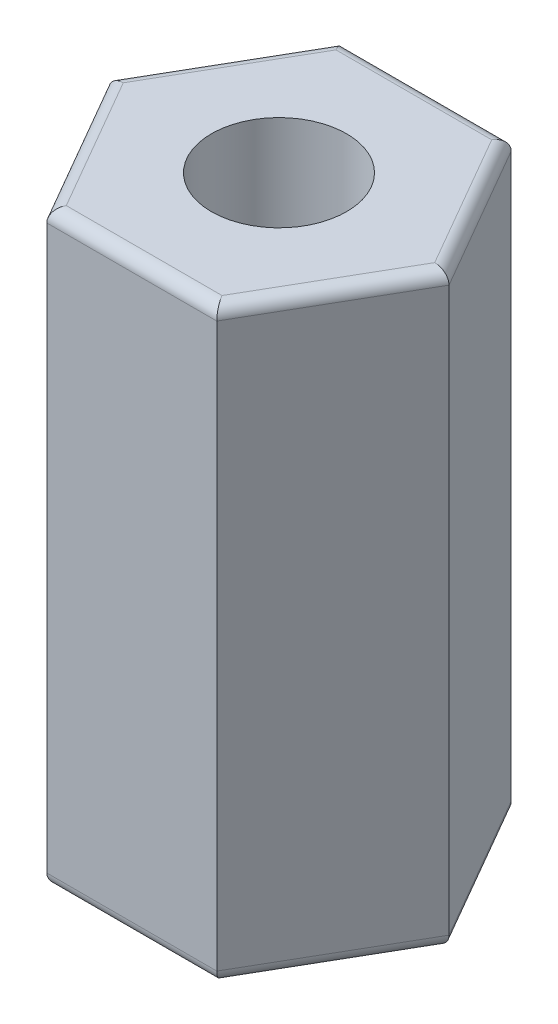
ISO-10303-21;
HEADER;
FILE_DESCRIPTION(('STEP AP214'),'2;1');
FILE_NAME('part.step','',(''),(''),'','','');
FILE_SCHEMA(('AUTOMOTIVE_DESIGN { 1 0 10303 214 1 1 1 1 }'));
ENDSEC;
DATA;
#1=APPLICATION_CONTEXT('core data for automotive mechanical design processes');
#2=APPLICATION_PROTOCOL_DEFINITION('international standard','automotive_design',2000,#1);
#3=PRODUCT_CONTEXT('',#1,'mechanical');
#4=PRODUCT('Part','Part','',(#3));
#5=PRODUCT_RELATED_PRODUCT_CATEGORY('part','',(#4));
#6=PRODUCT_DEFINITION_FORMATION('','',#4);
#7=PRODUCT_DEFINITION_CONTEXT('part definition',#1,'design');
#8=PRODUCT_DEFINITION('design','',#6,#7);
#9=PRODUCT_DEFINITION_SHAPE('','',#8);
#10=(LENGTH_UNIT() NAMED_UNIT(*) SI_UNIT(.MILLI.,.METRE.));
#11=(NAMED_UNIT(*) PLANE_ANGLE_UNIT() SI_UNIT($,.RADIAN.));
#12=(NAMED_UNIT(*) SI_UNIT($,.STERADIAN.) SOLID_ANGLE_UNIT());
#13=UNCERTAINTY_MEASURE_WITH_UNIT(LENGTH_MEASURE(1.E-05),#10,'distance_accuracy_value','');
#14=(GEOMETRIC_REPRESENTATION_CONTEXT(3) GLOBAL_UNCERTAINTY_ASSIGNED_CONTEXT((#13)) GLOBAL_UNIT_ASSIGNED_CONTEXT((#10,
#11,#12)) REPRESENTATION_CONTEXT('',''));
#15=CARTESIAN_POINT('',(0.,0.,0.));
#16=DIRECTION('',(0.,0.,1.));
#17=DIRECTION('',(1.,0.,0.));
#18=AXIS2_PLACEMENT_3D('',#15,#16,#17);
#19=CARTESIAN_POINT('',(1.37409364067131,9.5,2.38));
#20=DIRECTION('',(-0.866025403784439,0.,-0.5));
#21=DIRECTION('',(-0.5,0.,0.866025403784439));
#22=AXIS2_PLACEMENT_3D('',#19,#20,#21);
#23=PLANE('',#22);
#24=DIRECTION('',(0.,-1.,0.));
#25=VECTOR('',#24,1.);
#26=CARTESIAN_POINT('',(2.74818728134262,9.5,0.));
#27=LINE('',#26,#25);
#28=CARTESIAN_POINT('',(2.74818728134262,9.3,0.));
#29=VERTEX_POINT('',#28);
#30=CARTESIAN_POINT('',(2.74818728134262,0.200000000000001,0.));
#31=VERTEX_POINT('',#30);
#32=EDGE_CURVE('E149',#29,#31,#27,.T.);
#33=ORIENTED_EDGE('',*,*,#32,.F.);
#34=DIRECTION('',(0.5,0.,-0.866025403784439));
#35=VECTOR('',#34,1.);
#36=CARTESIAN_POINT('',(1.37409364067131,9.3,2.38));
#37=LINE('',#36,#35);
#38=CARTESIAN_POINT('',(1.37409364067131,9.3,2.38));
#39=VERTEX_POINT('',#38);
#40=EDGE_CURVE('E140',#29,#39,#37,.F.);
#41=ORIENTED_EDGE('',*,*,#40,.T.);
#42=DIRECTION('',(0.,-1.,0.));
#43=VECTOR('',#42,1.);
#44=CARTESIAN_POINT('',(1.37409364067131,9.5,2.38));
#45=LINE('',#44,#43);
#46=CARTESIAN_POINT('',(1.37409364067131,0.200000000000001,2.38));
#47=VERTEX_POINT('',#46);
#48=EDGE_CURVE('E206',#39,#47,#45,.T.);
#49=ORIENTED_EDGE('',*,*,#48,.T.);
#50=DIRECTION('',(0.5,0.,-0.866025403784439));
#51=VECTOR('',#50,1.);
#52=CARTESIAN_POINT('',(1.37409364067131,0.200000000000001,2.38));
#53=LINE('',#52,#51);
#54=EDGE_CURVE('E181',#47,#31,#53,.T.);
#55=ORIENTED_EDGE('',*,*,#54,.T.);
#56=EDGE_LOOP('',(#33,#41,#49,#55));
#57=FACE_BOUND('',#56,.T.);
#58=ADVANCED_FACE('F33',(#57),#23,.F.);
#59=CARTESIAN_POINT('',(2.74818728134262,9.5,0.));
#60=DIRECTION('',(-0.866025403784439,0.,0.5));
#61=DIRECTION('',(0.5,0.,0.866025403784439));
#62=AXIS2_PLACEMENT_3D('',#59,#60,#61);
#63=PLANE('',#62);
#64=DIRECTION('',(0.,-1.,0.));
#65=VECTOR('',#64,1.);
#66=CARTESIAN_POINT('',(1.37409364067131,9.5,-2.38));
#67=LINE('',#66,#65);
#68=CARTESIAN_POINT('',(1.37409364067131,9.3,-2.38));
#69=VERTEX_POINT('',#68);
#70=CARTESIAN_POINT('',(1.37409364067131,0.200000000000001,-2.38));
#71=VERTEX_POINT('',#70);
#72=EDGE_CURVE('E152',#69,#71,#67,.T.);
#73=ORIENTED_EDGE('',*,*,#72,.F.);
#74=DIRECTION('',(-0.5,0.,-0.866025403784439));
#75=VECTOR('',#74,1.);
#76=CARTESIAN_POINT('',(2.74818728134262,9.3,0.));
#77=LINE('',#76,#75);
#78=EDGE_CURVE('E186',#69,#29,#77,.F.);
#79=ORIENTED_EDGE('',*,*,#78,.T.);
#80=ORIENTED_EDGE('',*,*,#32,.T.);
#81=DIRECTION('',(-0.5,0.,-0.866025403784439));
#82=VECTOR('',#81,1.);
#83=CARTESIAN_POINT('',(2.74818728134262,0.200000000000001,0.));
#84=LINE('',#83,#82);
#85=EDGE_CURVE('E184',#31,#71,#84,.T.);
#86=ORIENTED_EDGE('',*,*,#85,.T.);
#87=EDGE_LOOP('',(#73,#79,#80,#86));
#88=FACE_BOUND('',#87,.T.);
#89=ADVANCED_FACE('F267',(#88),#63,.F.);
#90=CARTESIAN_POINT('',(1.37409364067131,9.5,-2.38));
#91=DIRECTION('',(0.,0.,1.));
#92=DIRECTION('',(1.,0.,0.));
#93=AXIS2_PLACEMENT_3D('',#90,#91,#92);
#94=PLANE('',#93);
#95=DIRECTION('',(0.,-1.,0.));
#96=VECTOR('',#95,1.);
#97=CARTESIAN_POINT('',(-1.37409364067131,9.5,-2.38));
#98=LINE('',#97,#96);
#99=CARTESIAN_POINT('',(-1.37409364067131,9.3,-2.38));
#100=VERTEX_POINT('',#99);
#101=CARTESIAN_POINT('',(-1.37409364067131,0.200000000000001,-2.38));
#102=VERTEX_POINT('',#101);
#103=EDGE_CURVE('E258',#100,#102,#98,.T.);
#104=ORIENTED_EDGE('',*,*,#103,.F.);
#105=DIRECTION('',(-1.,0.,0.));
#106=VECTOR('',#105,1.);
#107=CARTESIAN_POINT('',(1.37409364067131,9.3,-2.38));
#108=LINE('',#107,#106);
#109=EDGE_CURVE('E165',#100,#69,#108,.F.);
#110=ORIENTED_EDGE('',*,*,#109,.T.);
#111=ORIENTED_EDGE('',*,*,#72,.T.);
#112=DIRECTION('',(-1.,0.,0.));
#113=VECTOR('',#112,1.);
#114=CARTESIAN_POINT('',(1.37409364067131,0.200000000000001,-2.38));
#115=LINE('',#114,#113);
#116=EDGE_CURVE('E163',#71,#102,#115,.T.);
#117=ORIENTED_EDGE('',*,*,#116,.T.);
#118=EDGE_LOOP('',(#104,#110,#111,#117));
#119=FACE_BOUND('',#118,.T.);
#120=ADVANCED_FACE('F264',(#119),#94,.F.);
#121=CARTESIAN_POINT('',(-1.37409364067131,9.5,-2.38));
#122=DIRECTION('',(0.866025403784439,0.,0.5));
#123=DIRECTION('',(0.5,0.,-0.866025403784439));
#124=AXIS2_PLACEMENT_3D('',#121,#122,#123);
#125=PLANE('',#124);
#126=DIRECTION('',(0.,-1.,0.));
#127=VECTOR('',#126,1.);
#128=CARTESIAN_POINT('',(-2.74818728134262,9.5,0.));
#129=LINE('',#128,#127);
#130=CARTESIAN_POINT('',(-2.74818728134262,9.3,0.));
#131=VERTEX_POINT('',#130);
#132=CARTESIAN_POINT('',(-2.74818728134262,0.200000000000001,0.));
#133=VERTEX_POINT('',#132);
#134=EDGE_CURVE('E251',#131,#133,#129,.T.);
#135=ORIENTED_EDGE('',*,*,#134,.F.);
#136=DIRECTION('',(-0.5,0.,0.866025403784439));
#137=VECTOR('',#136,1.);
#138=CARTESIAN_POINT('',(-1.37409364067131,9.3,-2.38));
#139=LINE('',#138,#137);
#140=EDGE_CURVE('E170',#131,#100,#139,.F.);
#141=ORIENTED_EDGE('',*,*,#140,.T.);
#142=ORIENTED_EDGE('',*,*,#103,.T.);
#143=DIRECTION('',(-0.5,0.,0.866025403784439));
#144=VECTOR('',#143,1.);
#145=CARTESIAN_POINT('',(-1.37409364067131,0.200000000000001,-2.38));
#146=LINE('',#145,#144);
#147=EDGE_CURVE('E168',#102,#133,#146,.T.);
#148=ORIENTED_EDGE('',*,*,#147,.T.);
#149=EDGE_LOOP('',(#135,#141,#142,#148));
#150=FACE_BOUND('',#149,.T.);
#151=ADVANCED_FACE('F274',(#150),#125,.F.);
#152=CARTESIAN_POINT('',(-2.74818728134262,9.5,0.));
#153=DIRECTION('',(0.866025403784439,0.,-0.5));
#154=DIRECTION('',(-0.5,0.,-0.866025403784439));
#155=AXIS2_PLACEMENT_3D('',#152,#153,#154);
#156=PLANE('',#155);
#157=DIRECTION('',(0.,-1.,0.));
#158=VECTOR('',#157,1.);
#159=CARTESIAN_POINT('',(-1.37409364067131,9.5,2.38));
#160=LINE('',#159,#158);
#161=CARTESIAN_POINT('',(-1.37409364067131,9.3,2.38));
#162=VERTEX_POINT('',#161);
#163=CARTESIAN_POINT('',(-1.37409364067131,0.200000000000001,2.38));
#164=VERTEX_POINT('',#163);
#165=EDGE_CURVE('E247',#162,#164,#160,.T.);
#166=ORIENTED_EDGE('',*,*,#165,.F.);
#167=DIRECTION('',(0.5,0.,0.866025403784439));
#168=VECTOR('',#167,1.);
#169=CARTESIAN_POINT('',(-2.74818728134262,9.3,0.));
#170=LINE('',#169,#168);
#171=EDGE_CURVE('E174',#162,#131,#170,.F.);
#172=ORIENTED_EDGE('',*,*,#171,.T.);
#173=ORIENTED_EDGE('',*,*,#134,.T.);
#174=DIRECTION('',(0.5,0.,0.866025403784439));
#175=VECTOR('',#174,1.);
#176=CARTESIAN_POINT('',(-2.74818728134262,0.200000000000001,0.));
#177=LINE('',#176,#175);
#178=EDGE_CURVE('E172',#133,#164,#177,.T.);
#179=ORIENTED_EDGE('',*,*,#178,.T.);
#180=EDGE_LOOP('',(#166,#172,#173,#179));
#181=FACE_BOUND('',#180,.T.);
#182=ADVANCED_FACE('F361',(#181),#156,.F.);
#183=CARTESIAN_POINT('',(-1.37409364067131,9.5,2.38));
#184=DIRECTION('',(0.,0.,-1.));
#185=DIRECTION('',(-1.,0.,0.));
#186=AXIS2_PLACEMENT_3D('',#183,#184,#185);
#187=PLANE('',#186);
#188=ORIENTED_EDGE('',*,*,#48,.F.);
#189=DIRECTION('',(1.,0.,0.));
#190=VECTOR('',#189,1.);
#191=CARTESIAN_POINT('',(-1.37409364067131,9.3,2.38));
#192=LINE('',#191,#190);
#193=EDGE_CURVE('E179',#39,#162,#192,.F.);
#194=ORIENTED_EDGE('',*,*,#193,.T.);
#195=ORIENTED_EDGE('',*,*,#165,.T.);
#196=DIRECTION('',(1.,0.,0.));
#197=VECTOR('',#196,1.);
#198=CARTESIAN_POINT('',(-1.37409364067131,0.200000000000001,2.38));
#199=LINE('',#198,#197);
#200=EDGE_CURVE('E176',#164,#47,#199,.T.);
#201=ORIENTED_EDGE('',*,*,#200,.T.);
#202=EDGE_LOOP('',(#188,#194,#195,#201));
#203=FACE_BOUND('',#202,.T.);
#204=ADVANCED_FACE('F244',(#203),#187,.F.);
#205=CARTESIAN_POINT('',(2.74818728134262,9.5,0.));
#206=DIRECTION('',(0.,1.,0.));
#207=DIRECTION('',(0.,0.,1.));
#208=AXIS2_PLACEMENT_3D('',#205,#206,#207);
#209=PLANE('',#208);
#210=CARTESIAN_POINT('',(0.,9.5,0.));
#211=DIRECTION('',(0.,1.,0.));
#212=DIRECTION('',(0.,0.,1.));
#213=AXIS2_PLACEMENT_3D('',#210,#211,#212);
#214=CIRCLE('',#213,1.0922);
#215=CARTESIAN_POINT('',(0.,9.5,1.0922));
#216=VERTEX_POINT('',#215);
#217=EDGE_CURVE('E209',#216,#216,#214,.T.);
#218=ORIENTED_EDGE('',*,*,#217,.F.);
#219=EDGE_LOOP('',(#218));
#220=FACE_BOUND('',#219,.T.);
#221=DIRECTION('',(-0.5,0.,-0.866025403784439));
#222=VECTOR('',#221,1.);
#223=CARTESIAN_POINT('',(1.20088855991442,9.5,-2.28));
#224=LINE('',#223,#222);
#225=CARTESIAN_POINT('',(2.51724717366677,9.5,0.));
#226=VERTEX_POINT('',#225);
#227=CARTESIAN_POINT('',(1.25862358683338,9.5,-2.18));
#228=VERTEX_POINT('',#227);
#229=EDGE_CURVE('E128',#226,#228,#224,.T.);
#230=ORIENTED_EDGE('',*,*,#229,.T.);
#231=DIRECTION('',(-1.,0.,0.));
#232=VECTOR('',#231,1.);
#233=CARTESIAN_POINT('',(-1.37409364067131,9.5,-2.18));
#234=LINE('',#233,#232);
#235=CARTESIAN_POINT('',(-1.25862358683338,9.5,-2.18));
#236=VERTEX_POINT('',#235);
#237=EDGE_CURVE('E161',#228,#236,#234,.T.);
#238=ORIENTED_EDGE('',*,*,#237,.T.);
#239=DIRECTION('',(-0.5,0.,0.866025403784439));
#240=VECTOR('',#239,1.);
#241=CARTESIAN_POINT('',(-2.57498220058573,9.5,0.100000000000001));
#242=LINE('',#241,#240);
#243=CARTESIAN_POINT('',(-2.51724717366677,9.5,0.));
#244=VERTEX_POINT('',#243);
#245=EDGE_CURVE('E159',#236,#244,#242,.T.);
#246=ORIENTED_EDGE('',*,*,#245,.T.);
#247=DIRECTION('',(0.5,0.,0.866025403784439));
#248=VECTOR('',#247,1.);
#249=CARTESIAN_POINT('',(-1.20088855991442,9.5,2.28));
#250=LINE('',#249,#248);
#251=CARTESIAN_POINT('',(-1.25862358683339,9.5,2.18));
#252=VERTEX_POINT('',#251);
#253=EDGE_CURVE('E157',#244,#252,#250,.T.);
#254=ORIENTED_EDGE('',*,*,#253,.T.);
#255=DIRECTION('',(1.,0.,0.));
#256=VECTOR('',#255,1.);
#257=CARTESIAN_POINT('',(1.37409364067131,9.5,2.18));
#258=LINE('',#257,#256);
#259=CARTESIAN_POINT('',(1.25862358683338,9.5,2.18));
#260=VERTEX_POINT('',#259);
#261=EDGE_CURVE('E131',#252,#260,#258,.T.);
#262=ORIENTED_EDGE('',*,*,#261,.T.);
#263=DIRECTION('',(0.5,0.,-0.866025403784439));
#264=VECTOR('',#263,1.);
#265=CARTESIAN_POINT('',(2.57498220058573,9.5,-0.1));
#266=LINE('',#265,#264);
#267=EDGE_CURVE('E123',#260,#226,#266,.T.);
#268=ORIENTED_EDGE('',*,*,#267,.T.);
#269=EDGE_LOOP('',(#230,#238,#246,#254,#262,#268));
#270=FACE_BOUND('',#269,.T.);
#271=ADVANCED_FACE('F125',(#220,#270),#209,.T.);
#272=CARTESIAN_POINT('',(2.74818728134262,0.,0.));
#273=DIRECTION('',(0.,1.,0.));
#274=DIRECTION('',(0.,0.,1.));
#275=AXIS2_PLACEMENT_3D('',#272,#273,#274);
#276=PLANE('',#275);
#277=CARTESIAN_POINT('',(0.,0.,0.));
#278=DIRECTION('',(0.,-1.,0.));
#279=DIRECTION('',(0.,0.,-1.));
#280=AXIS2_PLACEMENT_3D('',#277,#278,#279);
#281=CIRCLE('',#280,1.0922);
#282=CARTESIAN_POINT('',(0.,0.,-1.0922));
#283=VERTEX_POINT('',#282);
#284=EDGE_CURVE('E460',#283,#283,#281,.T.);
#285=ORIENTED_EDGE('',*,*,#284,.F.);
#286=EDGE_LOOP('',(#285));
#287=FACE_BOUND('',#286,.T.);
#288=DIRECTION('',(0.5,0.,-0.866025403784439));
#289=VECTOR('',#288,1.);
#290=CARTESIAN_POINT('',(2.57498220058573,0.,-0.1));
#291=LINE('',#290,#289);
#292=CARTESIAN_POINT('',(2.51724717366677,0.,0.));
#293=VERTEX_POINT('',#292);
#294=CARTESIAN_POINT('',(1.25862358683338,0.,2.18));
#295=VERTEX_POINT('',#294);
#296=EDGE_CURVE('E188',#293,#295,#291,.F.);
#297=ORIENTED_EDGE('',*,*,#296,.T.);
#298=DIRECTION('',(1.,0.,0.));
#299=VECTOR('',#298,1.);
#300=CARTESIAN_POINT('',(2.74818728134262,0.,2.18));
#301=LINE('',#300,#299);
#302=CARTESIAN_POINT('',(-1.25862358683339,0.,2.18));
#303=VERTEX_POINT('',#302);
#304=EDGE_CURVE('E11',#295,#303,#301,.F.);
#305=ORIENTED_EDGE('',*,*,#304,.T.);
#306=DIRECTION('',(0.5,0.,0.866025403784439));
#307=VECTOR('',#306,1.);
#308=CARTESIAN_POINT('',(-1.20088855991442,0.,2.28));
#309=LINE('',#308,#307);
#310=CARTESIAN_POINT('',(-2.51724717366677,0.,0.));
#311=VERTEX_POINT('',#310);
#312=EDGE_CURVE('E42',#303,#311,#309,.F.);
#313=ORIENTED_EDGE('',*,*,#312,.T.);
#314=DIRECTION('',(-0.5,0.,0.866025403784439));
#315=VECTOR('',#314,1.);
#316=CARTESIAN_POINT('',(-1.20088855991442,0.,-2.28));
#317=LINE('',#316,#315);
#318=CARTESIAN_POINT('',(-1.25862358683338,0.,-2.18));
#319=VERTEX_POINT('',#318);
#320=EDGE_CURVE('E194',#311,#319,#317,.F.);
#321=ORIENTED_EDGE('',*,*,#320,.T.);
#322=DIRECTION('',(-1.,0.,0.));
#323=VECTOR('',#322,1.);
#324=CARTESIAN_POINT('',(2.74818728134262,0.,-2.18));
#325=LINE('',#324,#323);
#326=CARTESIAN_POINT('',(1.25862358683338,0.,-2.18));
#327=VERTEX_POINT('',#326);
#328=EDGE_CURVE('E192',#319,#327,#325,.F.);
#329=ORIENTED_EDGE('',*,*,#328,.T.);
#330=DIRECTION('',(-0.5,0.,-0.866025403784439));
#331=VECTOR('',#330,1.);
#332=CARTESIAN_POINT('',(2.57498220058573,0.,0.1));
#333=LINE('',#332,#331);
#334=EDGE_CURVE('E190',#327,#293,#333,.F.);
#335=ORIENTED_EDGE('',*,*,#334,.T.);
#336=EDGE_LOOP('',(#297,#305,#313,#321,#329,#335));
#337=FACE_BOUND('',#336,.T.);
#338=ADVANCED_FACE('F231',(#287,#337),#276,.F.);
#339=CARTESIAN_POINT('',(2.74818728134262,9.3,2.18));
#340=DIRECTION('',(-1.,0.,0.));
#341=DIRECTION('',(0.,0.,1.));
#342=AXIS2_PLACEMENT_3D('',#339,#340,#341);
#343=CYLINDRICAL_SURFACE('',#342,0.2);
#344=CARTESIAN_POINT('',(-1.25862358683339,9.3,2.18));
#345=DIRECTION('',(-0.866025403784439,0.,-0.5));
#346=DIRECTION('',(-0.5,0.,0.866025403784439));
#347=AXIS2_PLACEMENT_3D('',#344,#345,#346);
#348=ELLIPSE('',#347,0.23094010767585,0.2);
#349=EDGE_CURVE('E143',#162,#252,#348,.T.);
#350=ORIENTED_EDGE('',*,*,#349,.F.);
#351=ORIENTED_EDGE('',*,*,#193,.F.);
#352=CARTESIAN_POINT('',(1.25862358683338,9.3,2.18));
#353=DIRECTION('',(-0.866025403784438,0.,0.5));
#354=DIRECTION('',(0.5,0.,0.866025403784439));
#355=AXIS2_PLACEMENT_3D('',#352,#353,#354);
#356=ELLIPSE('',#355,0.23094010767585,0.2);
#357=EDGE_CURVE('E204',#260,#39,#356,.F.);
#358=ORIENTED_EDGE('',*,*,#357,.F.);
#359=ORIENTED_EDGE('',*,*,#261,.F.);
#360=EDGE_LOOP('',(#350,#351,#358,#359));
#361=FACE_BOUND('',#360,.T.);
#362=ADVANCED_FACE('F295',(#361),#343,.T.);
#363=CARTESIAN_POINT('',(2.57498220058573,9.3,-0.1));
#364=DIRECTION('',(-0.5,0.,0.866025403784439));
#365=DIRECTION('',(0.866025403784439,0.,0.5));
#366=AXIS2_PLACEMENT_3D('',#363,#364,#365);
#367=CYLINDRICAL_SURFACE('',#366,0.2);
#368=ORIENTED_EDGE('',*,*,#357,.T.);
#369=ORIENTED_EDGE('',*,*,#40,.F.);
#370=CARTESIAN_POINT('',(2.51724717366677,9.3,0.));
#371=DIRECTION('',(0.,0.,1.));
#372=DIRECTION('',(1.,0.,0.));
#373=AXIS2_PLACEMENT_3D('',#370,#371,#372);
#374=ELLIPSE('',#373,0.23094010767585,0.2);
#375=EDGE_CURVE('E138',#226,#29,#374,.F.);
#376=ORIENTED_EDGE('',*,*,#375,.F.);
#377=ORIENTED_EDGE('',*,*,#267,.F.);
#378=EDGE_LOOP('',(#368,#369,#376,#377));
#379=FACE_BOUND('',#378,.T.);
#380=ADVANCED_FACE('F139',(#379),#367,.T.);
#381=CARTESIAN_POINT('',(-1.20088855991442,9.3,2.28));
#382=DIRECTION('',(-0.5,0.,-0.866025403784439));
#383=DIRECTION('',(-0.866025403784439,0.,0.5));
#384=AXIS2_PLACEMENT_3D('',#381,#382,#383);
#385=CYLINDRICAL_SURFACE('',#384,0.2);
#386=ORIENTED_EDGE('',*,*,#349,.T.);
#387=ORIENTED_EDGE('',*,*,#253,.F.);
#388=CARTESIAN_POINT('',(-2.51724717366677,9.3,0.));
#389=DIRECTION('',(0.,0.,-1.));
#390=DIRECTION('',(-1.,0.,0.));
#391=AXIS2_PLACEMENT_3D('',#388,#389,#390);
#392=ELLIPSE('',#391,0.23094010767585,0.2);
#393=EDGE_CURVE('E144',#131,#244,#392,.T.);
#394=ORIENTED_EDGE('',*,*,#393,.F.);
#395=ORIENTED_EDGE('',*,*,#171,.F.);
#396=EDGE_LOOP('',(#386,#387,#394,#395));
#397=FACE_BOUND('',#396,.T.);
#398=ADVANCED_FACE('F289',(#397),#385,.T.);
#399=CARTESIAN_POINT('',(2.57498220058573,9.3,0.1));
#400=DIRECTION('',(0.5,0.,0.866025403784439));
#401=DIRECTION('',(0.866025403784439,0.,-0.5));
#402=AXIS2_PLACEMENT_3D('',#399,#400,#401);
#403=CYLINDRICAL_SURFACE('',#402,0.2);
#404=ORIENTED_EDGE('',*,*,#375,.T.);
#405=ORIENTED_EDGE('',*,*,#78,.F.);
#406=CARTESIAN_POINT('',(1.25862358683338,9.3,-2.18));
#407=DIRECTION('',(0.866025403784439,0.,0.5));
#408=DIRECTION('',(-0.5,0.,0.866025403784439));
#409=AXIS2_PLACEMENT_3D('',#406,#407,#408);
#410=ELLIPSE('',#409,0.23094010767585,0.2);
#411=EDGE_CURVE('E147',#228,#69,#410,.F.);
#412=ORIENTED_EDGE('',*,*,#411,.F.);
#413=ORIENTED_EDGE('',*,*,#229,.F.);
#414=EDGE_LOOP('',(#404,#405,#412,#413));
#415=FACE_BOUND('',#414,.T.);
#416=ADVANCED_FACE('F146',(#415),#403,.T.);
#417=CARTESIAN_POINT('',(-1.20088855991442,9.3,-2.28));
#418=DIRECTION('',(0.5,0.,-0.866025403784439));
#419=DIRECTION('',(-0.866025403784439,0.,-0.5));
#420=AXIS2_PLACEMENT_3D('',#417,#418,#419);
#421=CYLINDRICAL_SURFACE('',#420,0.2);
#422=ORIENTED_EDGE('',*,*,#393,.T.);
#423=ORIENTED_EDGE('',*,*,#245,.F.);
#424=CARTESIAN_POINT('',(-1.25862358683338,9.3,-2.18));
#425=DIRECTION('',(0.866025403784439,0.,-0.5));
#426=DIRECTION('',(-0.5,0.,-0.866025403784438));
#427=AXIS2_PLACEMENT_3D('',#424,#425,#426);
#428=ELLIPSE('',#427,0.23094010767585,0.2);
#429=EDGE_CURVE('E197',#100,#236,#428,.T.);
#430=ORIENTED_EDGE('',*,*,#429,.F.);
#431=ORIENTED_EDGE('',*,*,#140,.F.);
#432=EDGE_LOOP('',(#422,#423,#430,#431));
#433=FACE_BOUND('',#432,.T.);
#434=ADVANCED_FACE('F282',(#433),#421,.T.);
#435=CARTESIAN_POINT('',(2.74818728134262,9.3,-2.18));
#436=DIRECTION('',(1.,0.,0.));
#437=DIRECTION('',(0.,0.,-1.));
#438=AXIS2_PLACEMENT_3D('',#435,#436,#437);
#439=CYLINDRICAL_SURFACE('',#438,0.2);
#440=ORIENTED_EDGE('',*,*,#411,.T.);
#441=ORIENTED_EDGE('',*,*,#109,.F.);
#442=ORIENTED_EDGE('',*,*,#429,.T.);
#443=ORIENTED_EDGE('',*,*,#237,.F.);
#444=EDGE_LOOP('',(#440,#441,#442,#443));
#445=FACE_BOUND('',#444,.T.);
#446=ADVANCED_FACE('F279',(#445),#439,.T.);
#447=CARTESIAN_POINT('',(1.37409364067131,0.200000000000001,-2.18));
#448=DIRECTION('',(-1.,0.,0.));
#449=DIRECTION('',(0.,0.,1.));
#450=AXIS2_PLACEMENT_3D('',#447,#448,#449);
#451=CYLINDRICAL_SURFACE('',#450,0.2);
#452=CARTESIAN_POINT('',(1.25862358683338,0.200000000000001,-2.18));
#453=DIRECTION('',(-0.866025403784439,0.,-0.5));
#454=DIRECTION('',(0.5,0.,-0.866025403784439));
#455=AXIS2_PLACEMENT_3D('',#452,#453,#454);
#456=ELLIPSE('',#455,0.23094010767585,0.2);
#457=EDGE_CURVE('E216',#327,#71,#456,.F.);
#458=ORIENTED_EDGE('',*,*,#457,.F.);
#459=ORIENTED_EDGE('',*,*,#328,.F.);
#460=CARTESIAN_POINT('',(-1.25862358683338,0.200000000000001,-2.18));
#461=DIRECTION('',(-0.866025403784439,0.,0.5));
#462=DIRECTION('',(-0.5,0.,-0.866025403784438));
#463=AXIS2_PLACEMENT_3D('',#460,#461,#462);
#464=ELLIPSE('',#463,0.23094010767585,0.2);
#465=EDGE_CURVE('E37',#102,#319,#464,.T.);
#466=ORIENTED_EDGE('',*,*,#465,.F.);
#467=ORIENTED_EDGE('',*,*,#116,.F.);
#468=EDGE_LOOP('',(#458,#459,#466,#467));
#469=FACE_BOUND('',#468,.T.);
#470=ADVANCED_FACE('F35',(#469),#451,.T.);
#471=CARTESIAN_POINT('',(-1.20088855991442,0.200000000000001,-2.28));
#472=DIRECTION('',(-0.5,0.,0.866025403784439));
#473=DIRECTION('',(0.866025403784439,0.,0.5));
#474=AXIS2_PLACEMENT_3D('',#471,#472,#473);
#475=CYLINDRICAL_SURFACE('',#474,0.2);
#476=ORIENTED_EDGE('',*,*,#465,.T.);
#477=ORIENTED_EDGE('',*,*,#320,.F.);
#478=CARTESIAN_POINT('',(-2.51724717366677,0.200000000000001,0.));
#479=DIRECTION('',(0.,0.,1.));
#480=DIRECTION('',(-1.,0.,0.));
#481=AXIS2_PLACEMENT_3D('',#478,#479,#480);
#482=ELLIPSE('',#481,0.23094010767585,0.2);
#483=EDGE_CURVE('E214',#133,#311,#482,.T.);
#484=ORIENTED_EDGE('',*,*,#483,.F.);
#485=ORIENTED_EDGE('',*,*,#147,.F.);
#486=EDGE_LOOP('',(#476,#477,#484,#485));
#487=FACE_BOUND('',#486,.T.);
#488=ADVANCED_FACE('F226',(#487),#475,.T.);
#489=CARTESIAN_POINT('',(2.57498220058573,0.200000000000001,0.1));
#490=DIRECTION('',(-0.5,0.,-0.866025403784439));
#491=DIRECTION('',(-0.866025403784439,0.,0.5));
#492=AXIS2_PLACEMENT_3D('',#489,#490,#491);
#493=CYLINDRICAL_SURFACE('',#492,0.2);
#494=ORIENTED_EDGE('',*,*,#457,.T.);
#495=ORIENTED_EDGE('',*,*,#85,.F.);
#496=CARTESIAN_POINT('',(2.51724717366677,0.200000000000001,0.));
#497=DIRECTION('',(0.,0.,-1.));
#498=DIRECTION('',(1.,0.,0.));
#499=AXIS2_PLACEMENT_3D('',#496,#497,#498);
#500=ELLIPSE('',#499,0.23094010767585,0.2);
#501=EDGE_CURVE('E211',#293,#31,#500,.F.);
#502=ORIENTED_EDGE('',*,*,#501,.F.);
#503=ORIENTED_EDGE('',*,*,#334,.F.);
#504=EDGE_LOOP('',(#494,#495,#502,#503));
#505=FACE_BOUND('',#504,.T.);
#506=ADVANCED_FACE('F234',(#505),#493,.T.);
#507=CARTESIAN_POINT('',(-2.57498220058573,0.200000000000001,-0.0999999999999992));
#508=DIRECTION('',(0.5,0.,0.866025403784439));
#509=DIRECTION('',(0.866025403784439,0.,-0.5));
#510=AXIS2_PLACEMENT_3D('',#507,#508,#509);
#511=CYLINDRICAL_SURFACE('',#510,0.2);
#512=ORIENTED_EDGE('',*,*,#483,.T.);
#513=ORIENTED_EDGE('',*,*,#312,.F.);
#514=CARTESIAN_POINT('',(-1.25862358683339,0.200000000000001,2.18));
#515=DIRECTION('',(0.866025403784439,0.,0.5));
#516=DIRECTION('',(-0.5,0.,0.866025403784439));
#517=AXIS2_PLACEMENT_3D('',#514,#515,#516);
#518=ELLIPSE('',#517,0.23094010767585,0.2);
#519=EDGE_CURVE('E50',#164,#303,#518,.T.);
#520=ORIENTED_EDGE('',*,*,#519,.F.);
#521=ORIENTED_EDGE('',*,*,#178,.F.);
#522=EDGE_LOOP('',(#512,#513,#520,#521));
#523=FACE_BOUND('',#522,.T.);
#524=ADVANCED_FACE('F304',(#523),#511,.T.);
#525=CARTESIAN_POINT('',(1.20088855991442,0.200000000000001,2.28));
#526=DIRECTION('',(0.5,0.,-0.866025403784439));
#527=DIRECTION('',(-0.866025403784439,0.,-0.5));
#528=AXIS2_PLACEMENT_3D('',#525,#526,#527);
#529=CYLINDRICAL_SURFACE('',#528,0.2);
#530=ORIENTED_EDGE('',*,*,#501,.T.);
#531=ORIENTED_EDGE('',*,*,#54,.F.);
#532=CARTESIAN_POINT('',(1.25862358683338,0.200000000000001,2.18));
#533=DIRECTION('',(0.866025403784438,0.,-0.5));
#534=DIRECTION('',(-0.5,0.,-0.866025403784439));
#535=AXIS2_PLACEMENT_3D('',#532,#533,#534);
#536=ELLIPSE('',#535,0.23094010767585,0.2);
#537=EDGE_CURVE('E207',#295,#47,#536,.F.);
#538=ORIENTED_EDGE('',*,*,#537,.F.);
#539=ORIENTED_EDGE('',*,*,#296,.F.);
#540=EDGE_LOOP('',(#530,#531,#538,#539));
#541=FACE_BOUND('',#540,.T.);
#542=ADVANCED_FACE('F238',(#541),#529,.T.);
#543=CARTESIAN_POINT('',(-1.37409364067131,0.200000000000001,2.18));
#544=DIRECTION('',(1.,0.,0.));
#545=DIRECTION('',(0.,0.,-1.));
#546=AXIS2_PLACEMENT_3D('',#543,#544,#545);
#547=CYLINDRICAL_SURFACE('',#546,0.2);
#548=ORIENTED_EDGE('',*,*,#519,.T.);
#549=ORIENTED_EDGE('',*,*,#304,.F.);
#550=ORIENTED_EDGE('',*,*,#537,.T.);
#551=ORIENTED_EDGE('',*,*,#200,.F.);
#552=EDGE_LOOP('',(#548,#549,#550,#551));
#553=FACE_BOUND('',#552,.T.);
#554=ADVANCED_FACE('F239',(#553),#547,.T.);
#555=CARTESIAN_POINT('',(0.,4.74,0.));
#556=DIRECTION('',(0.,1.,0.));
#557=DIRECTION('',(0.,0.,1.));
#558=AXIS2_PLACEMENT_3D('',#555,#556,#557);
#559=CYLINDRICAL_SURFACE('',#558,1.0922);
#560=ORIENTED_EDGE('',*,*,#217,.T.);
#561=EDGE_LOOP('',(#560));
#562=FACE_BOUND('',#561,.T.);
#563=ORIENTED_EDGE('',*,*,#284,.T.);
#564=EDGE_LOOP('',(#563));
#565=FACE_BOUND('',#564,.T.);
#566=ADVANCED_FACE('F301',(#562,#565),#559,.F.);
#567=CLOSED_SHELL('',(#58,#89,#120,#151,#182,#204,#271,#338,#362,#380,#398,#416,#434,#446,#470,
#488,#506,#524,#542,#554,#566));
#568=MANIFOLD_SOLID_BREP('B2',#567);
#569=ADVANCED_BREP_SHAPE_REPRESENTATION('',(#18,#568),#14);
#570=SHAPE_DEFINITION_REPRESENTATION(#9,#569);
ENDSEC;
END-ISO-10303-21;
